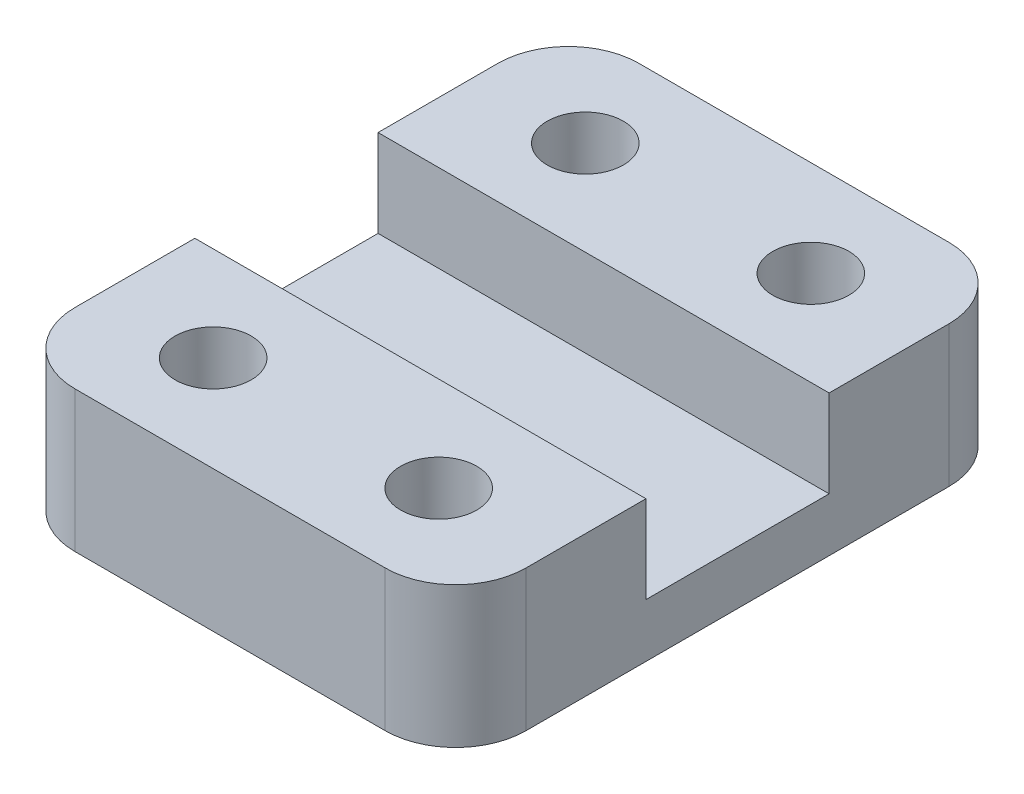
ISO-10303-21;
HEADER;
FILE_DESCRIPTION(('STEP AP214'),'2;1');
FILE_NAME('part.step','',(''),(''),'','','');
FILE_SCHEMA(('AUTOMOTIVE_DESIGN { 1 0 10303 214 1 1 1 1 }'));
ENDSEC;
DATA;
#1=APPLICATION_CONTEXT('core data for automotive mechanical design processes');
#2=APPLICATION_PROTOCOL_DEFINITION('international standard','automotive_design',2000,#1);
#3=PRODUCT_CONTEXT('',#1,'mechanical');
#4=PRODUCT('Part','Part','',(#3));
#5=PRODUCT_RELATED_PRODUCT_CATEGORY('part','',(#4));
#6=PRODUCT_DEFINITION_FORMATION('','',#4);
#7=PRODUCT_DEFINITION_CONTEXT('part definition',#1,'design');
#8=PRODUCT_DEFINITION('design','',#6,#7);
#9=PRODUCT_DEFINITION_SHAPE('','',#8);
#10=(LENGTH_UNIT() NAMED_UNIT(*) SI_UNIT(.MILLI.,.METRE.));
#11=(NAMED_UNIT(*) PLANE_ANGLE_UNIT() SI_UNIT($,.RADIAN.));
#12=(NAMED_UNIT(*) SI_UNIT($,.STERADIAN.) SOLID_ANGLE_UNIT());
#13=UNCERTAINTY_MEASURE_WITH_UNIT(LENGTH_MEASURE(1.E-05),#10,'distance_accuracy_value','');
#14=(GEOMETRIC_REPRESENTATION_CONTEXT(3) GLOBAL_UNCERTAINTY_ASSIGNED_CONTEXT((#13)) GLOBAL_UNIT_ASSIGNED_CONTEXT((#10,
#11,#12)) REPRESENTATION_CONTEXT('',''));
#15=CARTESIAN_POINT('',(0.,0.,0.));
#16=DIRECTION('',(0.,0.,1.));
#17=DIRECTION('',(1.,0.,0.));
#18=AXIS2_PLACEMENT_3D('',#15,#16,#17);
#19=CARTESIAN_POINT('',(0.,12.7,0.));
#20=DIRECTION('',(0.,-1.,0.));
#21=DIRECTION('',(0.,0.,-1.));
#22=AXIS2_PLACEMENT_3D('',#19,#20,#21);
#23=PLANE('',#22);
#24=CARTESIAN_POINT('',(30.48,12.7,-8.636));
#25=DIRECTION('',(0.,-1.,0.));
#26=DIRECTION('',(0.,0.,-1.));
#27=AXIS2_PLACEMENT_3D('',#24,#25,#26);
#28=CIRCLE('',#27,3.429);
#29=CARTESIAN_POINT('',(30.48,12.7,-12.065));
#30=VERTEX_POINT('',#29);
#31=EDGE_CURVE('E280',#30,#30,#28,.T.);
#32=ORIENTED_EDGE('',*,*,#31,.T.);
#33=EDGE_LOOP('',(#32));
#34=FACE_BOUND('',#33,.T.);
#35=CARTESIAN_POINT('',(10.16,12.7,-8.636));
#36=DIRECTION('',(0.,-1.,0.));
#37=DIRECTION('',(0.,0.,-1.));
#38=AXIS2_PLACEMENT_3D('',#35,#36,#37);
#39=CIRCLE('',#38,3.429);
#40=CARTESIAN_POINT('',(10.16,12.7,-12.065));
#41=VERTEX_POINT('',#40);
#42=EDGE_CURVE('E281',#41,#41,#39,.T.);
#43=ORIENTED_EDGE('',*,*,#42,.T.);
#44=EDGE_LOOP('',(#43));
#45=FACE_BOUND('',#44,.T.);
#46=DIRECTION('',(0.,0.,1.));
#47=VECTOR('',#46,1.);
#48=CARTESIAN_POINT('',(0.,12.7,0.));
#49=LINE('',#48,#47);
#50=CARTESIAN_POINT('',(0.,12.7,-17.149));
#51=VERTEX_POINT('',#50);
#52=CARTESIAN_POINT('',(0.,12.7,-6.35));
#53=VERTEX_POINT('',#52);
#54=EDGE_CURVE('E149',#51,#53,#49,.T.);
#55=ORIENTED_EDGE('',*,*,#54,.T.);
#56=CARTESIAN_POINT('',(6.35,12.7,-6.35));
#57=DIRECTION('',(0.,-1.,0.));
#58=DIRECTION('',(0.,0.,-1.));
#59=AXIS2_PLACEMENT_3D('',#56,#57,#58);
#60=CIRCLE('',#59,6.35);
#61=CARTESIAN_POINT('',(6.35,12.7,0.));
#62=VERTEX_POINT('',#61);
#63=EDGE_CURVE('E209',#53,#62,#60,.F.);
#64=ORIENTED_EDGE('',*,*,#63,.T.);
#65=DIRECTION('',(1.,0.,0.));
#66=VECTOR('',#65,1.);
#67=CARTESIAN_POINT('',(0.,12.7,0.));
#68=LINE('',#67,#66);
#69=CARTESIAN_POINT('',(34.29,12.7,0.));
#70=VERTEX_POINT('',#69);
#71=EDGE_CURVE('E166',#62,#70,#68,.T.);
#72=ORIENTED_EDGE('',*,*,#71,.T.);
#73=CARTESIAN_POINT('',(34.29,12.7,-6.35));
#74=DIRECTION('',(0.,-1.,0.));
#75=DIRECTION('',(0.,0.,-1.));
#76=AXIS2_PLACEMENT_3D('',#73,#74,#75);
#77=CIRCLE('',#76,6.35);
#78=CARTESIAN_POINT('',(40.64,12.7,-6.35));
#79=VERTEX_POINT('',#78);
#80=EDGE_CURVE('E207',#70,#79,#77,.F.);
#81=ORIENTED_EDGE('',*,*,#80,.T.);
#82=DIRECTION('',(0.,0.,-1.));
#83=VECTOR('',#82,1.);
#84=CARTESIAN_POINT('',(40.64,12.7,0.));
#85=LINE('',#84,#83);
#86=CARTESIAN_POINT('',(40.64,12.7,-17.149));
#87=VERTEX_POINT('',#86);
#88=EDGE_CURVE('E170',#79,#87,#85,.T.);
#89=ORIENTED_EDGE('',*,*,#88,.T.);
#90=DIRECTION('',(-1.,0.,0.));
#91=VECTOR('',#90,1.);
#92=CARTESIAN_POINT('',(0.,12.7,-17.149));
#93=LINE('',#92,#91);
#94=EDGE_CURVE('E185',#87,#51,#93,.T.);
#95=ORIENTED_EDGE('',*,*,#94,.T.);
#96=EDGE_LOOP('',(#55,#64,#72,#81,#89,#95));
#97=FACE_BOUND('',#96,.T.);
#98=ADVANCED_FACE('F33',(#34,#45,#97),#23,.F.);
#99=CARTESIAN_POINT('',(0.,12.7,0.));
#100=DIRECTION('',(1.,0.,0.));
#101=DIRECTION('',(0.,0.,-1.));
#102=AXIS2_PLACEMENT_3D('',#99,#100,#101);
#103=PLANE('',#102);
#104=DIRECTION('',(0.,0.,1.));
#105=VECTOR('',#104,1.);
#106=CARTESIAN_POINT('',(0.,0.,0.));
#107=LINE('',#106,#105);
#108=CARTESIAN_POINT('',(0.,0.,-44.45));
#109=VERTEX_POINT('',#108);
#110=CARTESIAN_POINT('',(0.,0.,-6.35));
#111=VERTEX_POINT('',#110);
#112=EDGE_CURVE('E163',#109,#111,#107,.T.);
#113=ORIENTED_EDGE('',*,*,#112,.T.);
#114=DIRECTION('',(0.,-1.,0.));
#115=VECTOR('',#114,1.);
#116=CARTESIAN_POINT('',(0.,12.7,-6.35));
#117=LINE('',#116,#115);
#118=EDGE_CURVE('E205',#111,#53,#117,.F.);
#119=ORIENTED_EDGE('',*,*,#118,.T.);
#120=ORIENTED_EDGE('',*,*,#54,.F.);
#121=DIRECTION('',(0.,-1.,0.));
#122=VECTOR('',#121,1.);
#123=CARTESIAN_POINT('',(0.,12.95,-17.149));
#124=LINE('',#123,#122);
#125=CARTESIAN_POINT('',(0.,4.83,-17.149));
#126=VERTEX_POINT('',#125);
#127=EDGE_CURVE('E128',#51,#126,#124,.T.);
#128=ORIENTED_EDGE('',*,*,#127,.T.);
#129=DIRECTION('',(0.,0.,-1.));
#130=VECTOR('',#129,1.);
#131=CARTESIAN_POINT('',(0.,4.83,-17.149));
#132=LINE('',#131,#130);
#133=CARTESIAN_POINT('',(0.,4.83,-33.651));
#134=VERTEX_POINT('',#133);
#135=EDGE_CURVE('E138',#126,#134,#132,.T.);
#136=ORIENTED_EDGE('',*,*,#135,.T.);
#137=DIRECTION('',(0.,1.,0.));
#138=VECTOR('',#137,1.);
#139=CARTESIAN_POINT('',(0.,12.95,-33.651));
#140=LINE('',#139,#138);
#141=CARTESIAN_POINT('',(0.,12.7,-33.651));
#142=VERTEX_POINT('',#141);
#143=EDGE_CURVE('E135',#134,#142,#140,.T.);
#144=ORIENTED_EDGE('',*,*,#143,.T.);
#145=CARTESIAN_POINT('',(0.,12.7,-44.45));
#146=VERTEX_POINT('',#145);
#147=EDGE_CURVE('E164',#146,#142,#49,.T.);
#148=ORIENTED_EDGE('',*,*,#147,.F.);
#149=DIRECTION('',(0.,-1.,0.));
#150=VECTOR('',#149,1.);
#151=CARTESIAN_POINT('',(0.,12.7,-44.45));
#152=LINE('',#151,#150);
#153=EDGE_CURVE('E202',#146,#109,#152,.T.);
#154=ORIENTED_EDGE('',*,*,#153,.T.);
#155=EDGE_LOOP('',(#113,#119,#120,#128,#136,#144,#148,#154));
#156=FACE_BOUND('',#155,.T.);
#157=ADVANCED_FACE('F147',(#156),#103,.F.);
#158=CARTESIAN_POINT('',(0.,12.7,0.));
#159=DIRECTION('',(0.,0.,-1.));
#160=DIRECTION('',(-1.,0.,0.));
#161=AXIS2_PLACEMENT_3D('',#158,#159,#160);
#162=PLANE('',#161);
#163=ORIENTED_EDGE('',*,*,#71,.F.);
#164=DIRECTION('',(0.,-1.,0.));
#165=VECTOR('',#164,1.);
#166=CARTESIAN_POINT('',(6.35,12.7,0.));
#167=LINE('',#166,#165);
#168=CARTESIAN_POINT('',(6.35,0.,0.));
#169=VERTEX_POINT('',#168);
#170=EDGE_CURVE('E191',#62,#169,#167,.T.);
#171=ORIENTED_EDGE('',*,*,#170,.T.);
#172=DIRECTION('',(1.,0.,0.));
#173=VECTOR('',#172,1.);
#174=CARTESIAN_POINT('',(0.,0.,0.));
#175=LINE('',#174,#173);
#176=CARTESIAN_POINT('',(34.29,0.,0.));
#177=VERTEX_POINT('',#176);
#178=EDGE_CURVE('E176',#169,#177,#175,.T.);
#179=ORIENTED_EDGE('',*,*,#178,.T.);
#180=DIRECTION('',(0.,-1.,0.));
#181=VECTOR('',#180,1.);
#182=CARTESIAN_POINT('',(34.29,12.7,0.));
#183=LINE('',#182,#181);
#184=EDGE_CURVE('E189',#177,#70,#183,.F.);
#185=ORIENTED_EDGE('',*,*,#184,.T.);
#186=EDGE_LOOP('',(#163,#171,#179,#185));
#187=FACE_BOUND('',#186,.T.);
#188=ADVANCED_FACE('F249',(#187),#162,.F.);
#189=CARTESIAN_POINT('',(40.64,12.7,0.));
#190=DIRECTION('',(-1.,0.,0.));
#191=DIRECTION('',(0.,0.,1.));
#192=AXIS2_PLACEMENT_3D('',#189,#190,#191);
#193=PLANE('',#192);
#194=DIRECTION('',(0.,0.,-1.));
#195=VECTOR('',#194,1.);
#196=CARTESIAN_POINT('',(40.64,0.,0.));
#197=LINE('',#196,#195);
#198=CARTESIAN_POINT('',(40.64,0.,-6.35));
#199=VERTEX_POINT('',#198);
#200=CARTESIAN_POINT('',(40.64,0.,-44.45));
#201=VERTEX_POINT('',#200);
#202=EDGE_CURVE('E179',#199,#201,#197,.T.);
#203=ORIENTED_EDGE('',*,*,#202,.T.);
#204=DIRECTION('',(0.,-1.,0.));
#205=VECTOR('',#204,1.);
#206=CARTESIAN_POINT('',(40.64,12.7,-44.45));
#207=LINE('',#206,#205);
#208=CARTESIAN_POINT('',(40.64,12.7,-44.45));
#209=VERTEX_POINT('',#208);
#210=EDGE_CURVE('E11',#201,#209,#207,.F.);
#211=ORIENTED_EDGE('',*,*,#210,.T.);
#212=CARTESIAN_POINT('',(40.64,12.7,-33.651));
#213=VERTEX_POINT('',#212);
#214=EDGE_CURVE('E169',#213,#209,#85,.T.);
#215=ORIENTED_EDGE('',*,*,#214,.F.);
#216=DIRECTION('',(0.,-1.,0.));
#217=VECTOR('',#216,1.);
#218=CARTESIAN_POINT('',(40.64,12.7,-33.651));
#219=LINE('',#218,#217);
#220=CARTESIAN_POINT('',(40.64,4.83,-33.651));
#221=VERTEX_POINT('',#220);
#222=EDGE_CURVE('E158',#213,#221,#219,.T.);
#223=ORIENTED_EDGE('',*,*,#222,.T.);
#224=DIRECTION('',(0.,0.,1.));
#225=VECTOR('',#224,1.);
#226=CARTESIAN_POINT('',(40.64,4.83,0.));
#227=LINE('',#226,#225);
#228=CARTESIAN_POINT('',(40.64,4.83,-17.149));
#229=VERTEX_POINT('',#228);
#230=EDGE_CURVE('E187',#221,#229,#227,.T.);
#231=ORIENTED_EDGE('',*,*,#230,.T.);
#232=DIRECTION('',(0.,1.,0.));
#233=VECTOR('',#232,1.);
#234=CARTESIAN_POINT('',(40.64,12.7,-17.149));
#235=LINE('',#234,#233);
#236=EDGE_CURVE('E131',#229,#87,#235,.T.);
#237=ORIENTED_EDGE('',*,*,#236,.T.);
#238=ORIENTED_EDGE('',*,*,#88,.F.);
#239=DIRECTION('',(0.,-1.,0.));
#240=VECTOR('',#239,1.);
#241=CARTESIAN_POINT('',(40.64,12.7,-6.35));
#242=LINE('',#241,#240);
#243=EDGE_CURVE('E41',#79,#199,#242,.T.);
#244=ORIENTED_EDGE('',*,*,#243,.T.);
#245=EDGE_LOOP('',(#203,#211,#215,#223,#231,#237,#238,#244));
#246=FACE_BOUND('',#245,.T.);
#247=ADVANCED_FACE('F222',(#246),#193,.F.);
#248=CARTESIAN_POINT('',(0.,12.7,-50.8));
#249=DIRECTION('',(0.,0.,1.));
#250=DIRECTION('',(1.,0.,0.));
#251=AXIS2_PLACEMENT_3D('',#248,#249,#250);
#252=PLANE('',#251);
#253=DIRECTION('',(-1.,0.,0.));
#254=VECTOR('',#253,1.);
#255=CARTESIAN_POINT('',(0.,0.,-50.8));
#256=LINE('',#255,#254);
#257=CARTESIAN_POINT('',(34.29,0.,-50.8));
#258=VERTEX_POINT('',#257);
#259=CARTESIAN_POINT('',(6.35,0.,-50.8));
#260=VERTEX_POINT('',#259);
#261=EDGE_CURVE('E181',#258,#260,#256,.T.);
#262=ORIENTED_EDGE('',*,*,#261,.T.);
#263=DIRECTION('',(0.,-1.,0.));
#264=VECTOR('',#263,1.);
#265=CARTESIAN_POINT('',(6.35,12.7,-50.8));
#266=LINE('',#265,#264);
#267=CARTESIAN_POINT('',(6.35,12.7,-50.8));
#268=VERTEX_POINT('',#267);
#269=EDGE_CURVE('E54',#260,#268,#266,.F.);
#270=ORIENTED_EDGE('',*,*,#269,.T.);
#271=DIRECTION('',(-1.,0.,0.));
#272=VECTOR('',#271,1.);
#273=CARTESIAN_POINT('',(0.,12.7,-50.8));
#274=LINE('',#273,#272);
#275=CARTESIAN_POINT('',(34.29,12.7,-50.8));
#276=VERTEX_POINT('',#275);
#277=EDGE_CURVE('E172',#276,#268,#274,.T.);
#278=ORIENTED_EDGE('',*,*,#277,.F.);
#279=DIRECTION('',(0.,-1.,0.));
#280=VECTOR('',#279,1.);
#281=CARTESIAN_POINT('',(34.29,12.7,-50.8));
#282=LINE('',#281,#280);
#283=EDGE_CURVE('E211',#276,#258,#282,.T.);
#284=ORIENTED_EDGE('',*,*,#283,.T.);
#285=EDGE_LOOP('',(#262,#270,#278,#284));
#286=FACE_BOUND('',#285,.T.);
#287=ADVANCED_FACE('F233',(#286),#252,.F.);
#288=CARTESIAN_POINT('',(10.1599999999999,12.7,-42.164));
#289=DIRECTION('',(0.,-1.,0.));
#290=DIRECTION('',(0.,0.,-1.));
#291=AXIS2_PLACEMENT_3D('',#288,#289,#290);
#292=CIRCLE('',#291,3.429);
#293=CARTESIAN_POINT('',(10.1599999999999,12.7,-45.593));
#294=VERTEX_POINT('',#293);
#295=EDGE_CURVE('E150',#294,#294,#292,.T.);
#296=ORIENTED_EDGE('',*,*,#295,.T.);
#297=EDGE_LOOP('',(#296));
#298=FACE_BOUND('',#297,.T.);
#299=CARTESIAN_POINT('',(30.4799999999999,12.7,-42.164));
#300=DIRECTION('',(0.,-1.,0.));
#301=DIRECTION('',(0.,0.,-1.));
#302=AXIS2_PLACEMENT_3D('',#299,#300,#301);
#303=CIRCLE('',#302,3.429);
#304=CARTESIAN_POINT('',(30.4799999999999,12.7,-45.593));
#305=VERTEX_POINT('',#304);
#306=EDGE_CURVE('E153',#305,#305,#303,.T.);
#307=ORIENTED_EDGE('',*,*,#306,.T.);
#308=EDGE_LOOP('',(#307));
#309=FACE_BOUND('',#308,.T.);
#310=ORIENTED_EDGE('',*,*,#277,.T.);
#311=CARTESIAN_POINT('',(6.35,12.7,-44.45));
#312=DIRECTION('',(0.,-1.,0.));
#313=DIRECTION('',(0.,0.,-1.));
#314=AXIS2_PLACEMENT_3D('',#311,#312,#313);
#315=CIRCLE('',#314,6.35);
#316=EDGE_CURVE('E217',#268,#146,#315,.F.);
#317=ORIENTED_EDGE('',*,*,#316,.T.);
#318=ORIENTED_EDGE('',*,*,#147,.T.);
#319=DIRECTION('',(1.,0.,0.));
#320=VECTOR('',#319,1.);
#321=CARTESIAN_POINT('',(0.,12.7,-33.651));
#322=LINE('',#321,#320);
#323=EDGE_CURVE('E174',#142,#213,#322,.T.);
#324=ORIENTED_EDGE('',*,*,#323,.T.);
#325=ORIENTED_EDGE('',*,*,#214,.T.);
#326=CARTESIAN_POINT('',(34.29,12.7,-44.45));
#327=DIRECTION('',(0.,-1.,0.));
#328=DIRECTION('',(0.,0.,-1.));
#329=AXIS2_PLACEMENT_3D('',#326,#327,#328);
#330=CIRCLE('',#329,6.35);
#331=EDGE_CURVE('E215',#209,#276,#330,.F.);
#332=ORIENTED_EDGE('',*,*,#331,.T.);
#333=EDGE_LOOP('',(#310,#317,#318,#324,#325,#332));
#334=FACE_BOUND('',#333,.T.);
#335=ADVANCED_FACE('F236',(#298,#309,#334),#23,.F.);
#336=CARTESIAN_POINT('',(0.,0.,0.));
#337=DIRECTION('',(0.,-1.,0.));
#338=DIRECTION('',(0.,0.,-1.));
#339=AXIS2_PLACEMENT_3D('',#336,#337,#338);
#340=PLANE('',#339);
#341=CARTESIAN_POINT('',(10.1599999999999,0.,-42.164));
#342=DIRECTION('',(0.,1.,0.));
#343=DIRECTION('',(0.,0.,1.));
#344=AXIS2_PLACEMENT_3D('',#341,#342,#343);
#345=CIRCLE('',#344,3.429);
#346=CARTESIAN_POINT('',(10.1599999999999,0.,-38.735));
#347=VERTEX_POINT('',#346);
#348=EDGE_CURVE('E290',#347,#347,#345,.T.);
#349=ORIENTED_EDGE('',*,*,#348,.T.);
#350=EDGE_LOOP('',(#349));
#351=FACE_BOUND('',#350,.T.);
#352=CARTESIAN_POINT('',(30.4799999999999,0.,-42.164));
#353=DIRECTION('',(0.,1.,0.));
#354=DIRECTION('',(0.,0.,1.));
#355=AXIS2_PLACEMENT_3D('',#352,#353,#354);
#356=CIRCLE('',#355,3.429);
#357=CARTESIAN_POINT('',(30.4799999999999,0.,-38.735));
#358=VERTEX_POINT('',#357);
#359=EDGE_CURVE('E293',#358,#358,#356,.T.);
#360=ORIENTED_EDGE('',*,*,#359,.T.);
#361=EDGE_LOOP('',(#360));
#362=FACE_BOUND('',#361,.T.);
#363=CARTESIAN_POINT('',(30.48,0.,-8.636));
#364=DIRECTION('',(0.,1.,0.));
#365=DIRECTION('',(0.,0.,1.));
#366=AXIS2_PLACEMENT_3D('',#363,#364,#365);
#367=CIRCLE('',#366,3.429);
#368=CARTESIAN_POINT('',(30.48,0.,-5.207));
#369=VERTEX_POINT('',#368);
#370=EDGE_CURVE('E289',#369,#369,#367,.T.);
#371=ORIENTED_EDGE('',*,*,#370,.T.);
#372=EDGE_LOOP('',(#371));
#373=FACE_BOUND('',#372,.T.);
#374=CARTESIAN_POINT('',(10.16,0.,-8.636));
#375=DIRECTION('',(0.,1.,0.));
#376=DIRECTION('',(0.,0.,1.));
#377=AXIS2_PLACEMENT_3D('',#374,#375,#376);
#378=CIRCLE('',#377,3.429);
#379=CARTESIAN_POINT('',(10.16,0.,-5.207));
#380=VERTEX_POINT('',#379);
#381=EDGE_CURVE('E286',#380,#380,#378,.T.);
#382=ORIENTED_EDGE('',*,*,#381,.T.);
#383=EDGE_LOOP('',(#382));
#384=FACE_BOUND('',#383,.T.);
#385=ORIENTED_EDGE('',*,*,#178,.F.);
#386=CARTESIAN_POINT('',(6.35,0.,-6.35));
#387=DIRECTION('',(0.,-1.,0.));
#388=DIRECTION('',(0.,0.,-1.));
#389=AXIS2_PLACEMENT_3D('',#386,#387,#388);
#390=CIRCLE('',#389,6.35);
#391=EDGE_CURVE('E200',#169,#111,#390,.T.);
#392=ORIENTED_EDGE('',*,*,#391,.T.);
#393=ORIENTED_EDGE('',*,*,#112,.F.);
#394=CARTESIAN_POINT('',(6.35,0.,-44.45));
#395=DIRECTION('',(0.,-1.,0.));
#396=DIRECTION('',(0.,0.,-1.));
#397=AXIS2_PLACEMENT_3D('',#394,#395,#396);
#398=CIRCLE('',#397,6.35);
#399=EDGE_CURVE('E198',#109,#260,#398,.T.);
#400=ORIENTED_EDGE('',*,*,#399,.T.);
#401=ORIENTED_EDGE('',*,*,#261,.F.);
#402=CARTESIAN_POINT('',(34.29,0.,-44.45));
#403=DIRECTION('',(0.,-1.,0.));
#404=DIRECTION('',(0.,0.,-1.));
#405=AXIS2_PLACEMENT_3D('',#402,#403,#404);
#406=CIRCLE('',#405,6.35);
#407=EDGE_CURVE('E196',#258,#201,#406,.T.);
#408=ORIENTED_EDGE('',*,*,#407,.T.);
#409=ORIENTED_EDGE('',*,*,#202,.F.);
#410=CARTESIAN_POINT('',(34.29,0.,-6.35));
#411=DIRECTION('',(0.,-1.,0.));
#412=DIRECTION('',(0.,0.,-1.));
#413=AXIS2_PLACEMENT_3D('',#410,#411,#412);
#414=CIRCLE('',#413,6.35);
#415=EDGE_CURVE('E194',#199,#177,#414,.T.);
#416=ORIENTED_EDGE('',*,*,#415,.T.);
#417=EDGE_LOOP('',(#385,#392,#393,#400,#401,#408,#409,#416));
#418=FACE_BOUND('',#417,.T.);
#419=ADVANCED_FACE('F227',(#351,#362,#373,#384,#418),#340,.T.);
#420=CARTESIAN_POINT('',(0.,4.83,-17.149));
#421=DIRECTION('',(0.,-1.,0.));
#422=DIRECTION('',(0.,0.,-1.));
#423=AXIS2_PLACEMENT_3D('',#420,#421,#422);
#424=PLANE('',#423);
#425=DIRECTION('',(1.,0.,0.));
#426=VECTOR('',#425,1.);
#427=CARTESIAN_POINT('',(0.,4.83,-33.651));
#428=LINE('',#427,#426);
#429=EDGE_CURVE('E134',#134,#221,#428,.T.);
#430=ORIENTED_EDGE('',*,*,#429,.F.);
#431=ORIENTED_EDGE('',*,*,#135,.F.);
#432=DIRECTION('',(1.,0.,0.));
#433=VECTOR('',#432,1.);
#434=CARTESIAN_POINT('',(0.,4.83,-17.149));
#435=LINE('',#434,#433);
#436=EDGE_CURVE('E123',#126,#229,#435,.T.);
#437=ORIENTED_EDGE('',*,*,#436,.T.);
#438=ORIENTED_EDGE('',*,*,#230,.F.);
#439=EDGE_LOOP('',(#430,#431,#437,#438));
#440=FACE_BOUND('',#439,.T.);
#441=ADVANCED_FACE('F139',(#440),#424,.F.);
#442=CARTESIAN_POINT('',(0.,12.95,-17.149));
#443=DIRECTION('',(0.,0.,1.));
#444=DIRECTION('',(1.,0.,0.));
#445=AXIS2_PLACEMENT_3D('',#442,#443,#444);
#446=PLANE('',#445);
#447=ORIENTED_EDGE('',*,*,#436,.F.);
#448=ORIENTED_EDGE('',*,*,#127,.F.);
#449=ORIENTED_EDGE('',*,*,#94,.F.);
#450=ORIENTED_EDGE('',*,*,#236,.F.);
#451=EDGE_LOOP('',(#447,#448,#449,#450));
#452=FACE_BOUND('',#451,.T.);
#453=ADVANCED_FACE('F125',(#452),#446,.F.);
#454=CARTESIAN_POINT('',(0.,12.95,-33.651));
#455=DIRECTION('',(0.,0.,-1.));
#456=DIRECTION('',(-1.,0.,0.));
#457=AXIS2_PLACEMENT_3D('',#454,#455,#456);
#458=PLANE('',#457);
#459=ORIENTED_EDGE('',*,*,#323,.F.);
#460=ORIENTED_EDGE('',*,*,#143,.F.);
#461=ORIENTED_EDGE('',*,*,#429,.T.);
#462=ORIENTED_EDGE('',*,*,#222,.F.);
#463=EDGE_LOOP('',(#459,#460,#461,#462));
#464=FACE_BOUND('',#463,.T.);
#465=ADVANCED_FACE('F315',(#464),#458,.F.);
#466=CARTESIAN_POINT('',(10.16,0.,-8.636));
#467=DIRECTION('',(0.,1.,0.));
#468=DIRECTION('',(0.,0.,1.));
#469=AXIS2_PLACEMENT_3D('',#466,#467,#468);
#470=CYLINDRICAL_SURFACE('',#469,3.429);
#471=ORIENTED_EDGE('',*,*,#381,.F.);
#472=EDGE_LOOP('',(#471));
#473=FACE_BOUND('',#472,.T.);
#474=ORIENTED_EDGE('',*,*,#42,.F.);
#475=EDGE_LOOP('',(#474));
#476=FACE_BOUND('',#475,.T.);
#477=ADVANCED_FACE('F305',(#473,#476),#470,.F.);
#478=CARTESIAN_POINT('',(30.48,0.,-8.636));
#479=DIRECTION('',(0.,1.,0.));
#480=DIRECTION('',(0.,0.,1.));
#481=AXIS2_PLACEMENT_3D('',#478,#479,#480);
#482=CYLINDRICAL_SURFACE('',#481,3.429);
#483=ORIENTED_EDGE('',*,*,#370,.F.);
#484=EDGE_LOOP('',(#483));
#485=FACE_BOUND('',#484,.T.);
#486=ORIENTED_EDGE('',*,*,#31,.F.);
#487=EDGE_LOOP('',(#486));
#488=FACE_BOUND('',#487,.T.);
#489=ADVANCED_FACE('F301',(#485,#488),#482,.F.);
#490=CARTESIAN_POINT('',(30.4799999999999,0.,-42.164));
#491=DIRECTION('',(0.,1.,0.));
#492=DIRECTION('',(0.,0.,1.));
#493=AXIS2_PLACEMENT_3D('',#490,#491,#492);
#494=CYLINDRICAL_SURFACE('',#493,3.429);
#495=ORIENTED_EDGE('',*,*,#359,.F.);
#496=EDGE_LOOP('',(#495));
#497=FACE_BOUND('',#496,.T.);
#498=ORIENTED_EDGE('',*,*,#306,.F.);
#499=EDGE_LOOP('',(#498));
#500=FACE_BOUND('',#499,.T.);
#501=ADVANCED_FACE('F304',(#497,#500),#494,.F.);
#502=CARTESIAN_POINT('',(10.1599999999999,0.,-42.164));
#503=DIRECTION('',(0.,1.,0.));
#504=DIRECTION('',(0.,0.,1.));
#505=AXIS2_PLACEMENT_3D('',#502,#503,#504);
#506=CYLINDRICAL_SURFACE('',#505,3.429);
#507=ORIENTED_EDGE('',*,*,#348,.F.);
#508=EDGE_LOOP('',(#507));
#509=FACE_BOUND('',#508,.T.);
#510=ORIENTED_EDGE('',*,*,#295,.F.);
#511=EDGE_LOOP('',(#510));
#512=FACE_BOUND('',#511,.T.);
#513=ADVANCED_FACE('F312',(#509,#512),#506,.F.);
#514=CARTESIAN_POINT('',(6.35,12.7,-6.35));
#515=DIRECTION('',(0.,-1.,0.));
#516=DIRECTION('',(0.,0.,-1.));
#517=AXIS2_PLACEMENT_3D('',#514,#515,#516);
#518=CYLINDRICAL_SURFACE('',#517,6.35);
#519=ORIENTED_EDGE('',*,*,#63,.F.);
#520=ORIENTED_EDGE('',*,*,#118,.F.);
#521=ORIENTED_EDGE('',*,*,#391,.F.);
#522=ORIENTED_EDGE('',*,*,#170,.F.);
#523=EDGE_LOOP('',(#519,#520,#521,#522));
#524=FACE_BOUND('',#523,.T.);
#525=ADVANCED_FACE('F246',(#524),#518,.T.);
#526=CARTESIAN_POINT('',(6.35,12.7,-44.45));
#527=DIRECTION('',(0.,-1.,0.));
#528=DIRECTION('',(0.,0.,-1.));
#529=AXIS2_PLACEMENT_3D('',#526,#527,#528);
#530=CYLINDRICAL_SURFACE('',#529,6.35);
#531=ORIENTED_EDGE('',*,*,#316,.F.);
#532=ORIENTED_EDGE('',*,*,#269,.F.);
#533=ORIENTED_EDGE('',*,*,#399,.F.);
#534=ORIENTED_EDGE('',*,*,#153,.F.);
#535=EDGE_LOOP('',(#531,#532,#533,#534));
#536=FACE_BOUND('',#535,.T.);
#537=ADVANCED_FACE('F240',(#536),#530,.T.);
#538=CARTESIAN_POINT('',(34.29,12.7,-44.45));
#539=DIRECTION('',(0.,-1.,0.));
#540=DIRECTION('',(0.,0.,-1.));
#541=AXIS2_PLACEMENT_3D('',#538,#539,#540);
#542=CYLINDRICAL_SURFACE('',#541,6.35);
#543=ORIENTED_EDGE('',*,*,#331,.F.);
#544=ORIENTED_EDGE('',*,*,#210,.F.);
#545=ORIENTED_EDGE('',*,*,#407,.F.);
#546=ORIENTED_EDGE('',*,*,#283,.F.);
#547=EDGE_LOOP('',(#543,#544,#545,#546));
#548=FACE_BOUND('',#547,.T.);
#549=ADVANCED_FACE('F232',(#548),#542,.T.);
#550=CARTESIAN_POINT('',(34.29,12.7,-6.35));
#551=DIRECTION('',(0.,-1.,0.));
#552=DIRECTION('',(0.,0.,-1.));
#553=AXIS2_PLACEMENT_3D('',#550,#551,#552);
#554=CYLINDRICAL_SURFACE('',#553,6.35);
#555=ORIENTED_EDGE('',*,*,#80,.F.);
#556=ORIENTED_EDGE('',*,*,#184,.F.);
#557=ORIENTED_EDGE('',*,*,#415,.F.);
#558=ORIENTED_EDGE('',*,*,#243,.F.);
#559=EDGE_LOOP('',(#555,#556,#557,#558));
#560=FACE_BOUND('',#559,.T.);
#561=ADVANCED_FACE('F35',(#560),#554,.T.);
#562=CLOSED_SHELL('',(#98,#157,#188,#247,#287,#335,#419,#441,#453,#465,#477,#489,#501,#513,#525,
#537,#549,#561));
#563=MANIFOLD_SOLID_BREP('B2',#562);
#564=ADVANCED_BREP_SHAPE_REPRESENTATION('',(#18,#563),#14);
#565=SHAPE_DEFINITION_REPRESENTATION(#9,#564);
ENDSEC;
END-ISO-10303-21;
